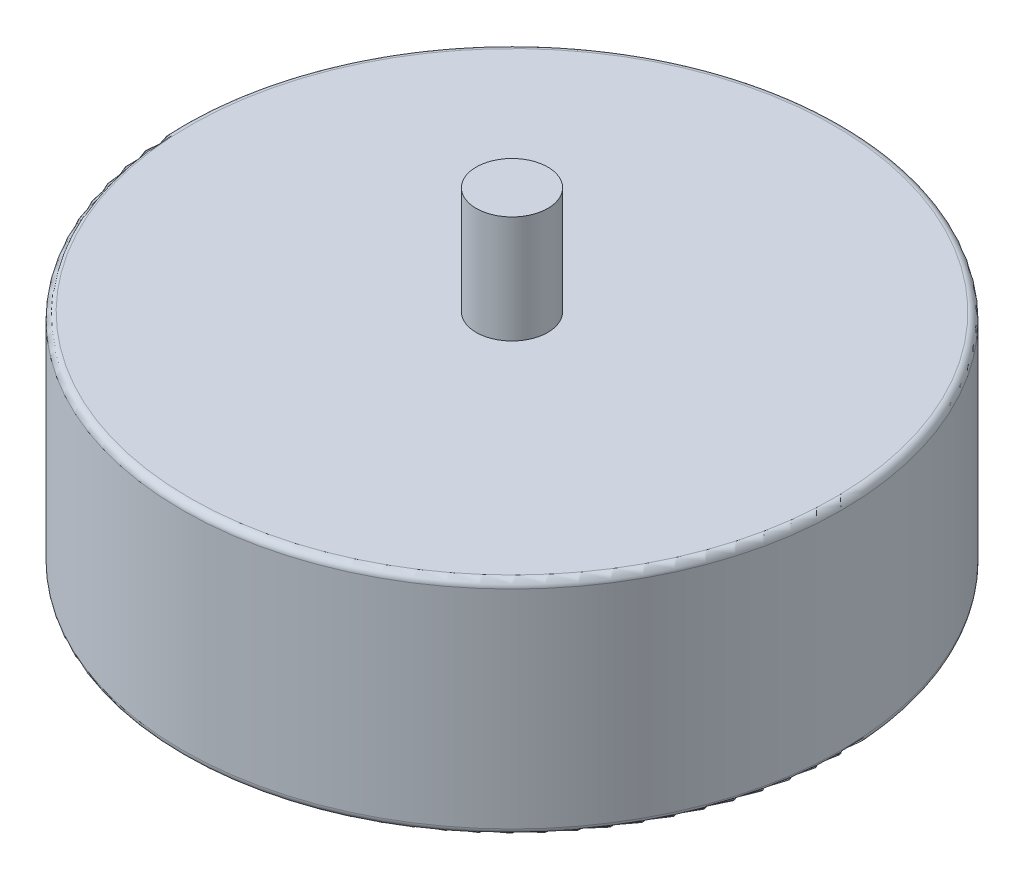
ISO-10303-21;
HEADER;
FILE_DESCRIPTION(('STEP AP214'),'2;1');
FILE_NAME('part.step','',(''),(''),'','','');
FILE_SCHEMA(('AUTOMOTIVE_DESIGN { 1 0 10303 214 1 1 1 1 }'));
ENDSEC;
DATA;
#1=APPLICATION_CONTEXT('core data for automotive mechanical design processes');
#2=APPLICATION_PROTOCOL_DEFINITION('international standard','automotive_design',2000,#1);
#3=PRODUCT_CONTEXT('',#1,'mechanical');
#4=PRODUCT('Part','Part','',(#3));
#5=PRODUCT_RELATED_PRODUCT_CATEGORY('part','',(#4));
#6=PRODUCT_DEFINITION_FORMATION('','',#4);
#7=PRODUCT_DEFINITION_CONTEXT('part definition',#1,'design');
#8=PRODUCT_DEFINITION('design','',#6,#7);
#9=PRODUCT_DEFINITION_SHAPE('','',#8);
#10=(LENGTH_UNIT() NAMED_UNIT(*) SI_UNIT(.MILLI.,.METRE.));
#11=(NAMED_UNIT(*) PLANE_ANGLE_UNIT() SI_UNIT($,.RADIAN.));
#12=(NAMED_UNIT(*) SI_UNIT($,.STERADIAN.) SOLID_ANGLE_UNIT());
#13=UNCERTAINTY_MEASURE_WITH_UNIT(LENGTH_MEASURE(1.E-05),#10,'distance_accuracy_value','');
#14=(GEOMETRIC_REPRESENTATION_CONTEXT(3) GLOBAL_UNCERTAINTY_ASSIGNED_CONTEXT((#13)) GLOBAL_UNIT_ASSIGNED_CONTEXT((#10,
#11,#12)) REPRESENTATION_CONTEXT('',''));
#15=CARTESIAN_POINT('',(0.,0.,0.));
#16=DIRECTION('',(0.,0.,1.));
#17=DIRECTION('',(1.,0.,0.));
#18=AXIS2_PLACEMENT_3D('',#15,#16,#17);
#19=CARTESIAN_POINT('',(0.,31.,0.));
#20=DIRECTION('',(0.,-1.,0.));
#21=DIRECTION('',(0.,0.,-1.));
#22=AXIS2_PLACEMENT_3D('',#19,#20,#21);
#23=CYLINDRICAL_SURFACE('',#22,46.);
#24=CARTESIAN_POINT('',(0.,1.,0.));
#25=DIRECTION('',(0.,1.,0.));
#26=DIRECTION('',(0.,0.,1.));
#27=AXIS2_PLACEMENT_3D('',#24,#25,#26);
#28=CIRCLE('',#27,46.);
#29=CARTESIAN_POINT('',(0.,1.,46.));
#30=VERTEX_POINT('',#29);
#31=EDGE_CURVE('E50',#30,#30,#28,.T.);
#32=ORIENTED_EDGE('',*,*,#31,.T.);
#33=EDGE_LOOP('',(#32));
#34=FACE_BOUND('',#33,.T.);
#35=CARTESIAN_POINT('',(0.,30.,0.));
#36=DIRECTION('',(0.,1.,0.));
#37=DIRECTION('',(0.,0.,1.));
#38=AXIS2_PLACEMENT_3D('',#35,#36,#37);
#39=CIRCLE('',#38,46.);
#40=CARTESIAN_POINT('',(0.,30.,46.));
#41=VERTEX_POINT('',#40);
#42=EDGE_CURVE('E55',#41,#41,#39,.F.);
#43=ORIENTED_EDGE('',*,*,#42,.T.);
#44=EDGE_LOOP('',(#43));
#45=FACE_BOUND('',#44,.T.);
#46=ADVANCED_FACE('F37',(#34,#45),#23,.T.);
#47=CARTESIAN_POINT('',(0.,31.,0.));
#48=DIRECTION('',(0.,1.,0.));
#49=DIRECTION('',(0.,0.,1.));
#50=AXIS2_PLACEMENT_3D('',#47,#48,#49);
#51=PLANE('',#50);
#52=CARTESIAN_POINT('',(0.,31.,0.));
#53=DIRECTION('',(0.,1.,0.));
#54=DIRECTION('',(0.,0.,1.));
#55=AXIS2_PLACEMENT_3D('',#52,#53,#54);
#56=CIRCLE('',#55,45.);
#57=CARTESIAN_POINT('',(0.,31.,45.));
#58=VERTEX_POINT('',#57);
#59=EDGE_CURVE('E10',#58,#58,#56,.T.);
#60=ORIENTED_EDGE('',*,*,#59,.T.);
#61=EDGE_LOOP('',(#60));
#62=FACE_BOUND('',#61,.T.);
#63=CARTESIAN_POINT('',(0.,31.,0.));
#64=DIRECTION('',(0.,1.,0.));
#65=DIRECTION('',(0.,0.,1.));
#66=AXIS2_PLACEMENT_3D('',#63,#64,#65);
#67=CIRCLE('',#66,5.);
#68=CARTESIAN_POINT('',(0.,31.,5.));
#69=VERTEX_POINT('',#68);
#70=EDGE_CURVE('E62',#69,#69,#67,.T.);
#71=ORIENTED_EDGE('',*,*,#70,.F.);
#72=EDGE_LOOP('',(#71));
#73=FACE_BOUND('',#72,.T.);
#74=ADVANCED_FACE('F79',(#62,#73),#51,.T.);
#75=CARTESIAN_POINT('',(0.,0.,0.));
#76=DIRECTION('',(0.,1.,0.));
#77=DIRECTION('',(0.,0.,1.));
#78=AXIS2_PLACEMENT_3D('',#75,#76,#77);
#79=PLANE('',#78);
#80=CARTESIAN_POINT('',(0.,0.,0.));
#81=DIRECTION('',(0.,1.,0.));
#82=DIRECTION('',(0.,0.,1.));
#83=AXIS2_PLACEMENT_3D('',#80,#81,#82);
#84=CIRCLE('',#83,45.);
#85=CARTESIAN_POINT('',(0.,0.,45.));
#86=VERTEX_POINT('',#85);
#87=EDGE_CURVE('E45',#86,#86,#84,.F.);
#88=ORIENTED_EDGE('',*,*,#87,.T.);
#89=EDGE_LOOP('',(#88));
#90=FACE_BOUND('',#89,.T.);
#91=ADVANCED_FACE('F75',(#90),#79,.F.);
#92=CARTESIAN_POINT('',(0.,46.,0.));
#93=DIRECTION('',(0.,-1.,0.));
#94=DIRECTION('',(0.,0.,-1.));
#95=AXIS2_PLACEMENT_3D('',#92,#93,#94);
#96=CYLINDRICAL_SURFACE('',#95,5.);
#97=CARTESIAN_POINT('',(0.,46.,0.));
#98=DIRECTION('',(0.,1.,0.));
#99=DIRECTION('',(0.,0.,1.));
#100=AXIS2_PLACEMENT_3D('',#97,#98,#99);
#101=CIRCLE('',#100,5.);
#102=CARTESIAN_POINT('',(0.,46.,5.));
#103=VERTEX_POINT('',#102);
#104=EDGE_CURVE('E61',#103,#103,#101,.T.);
#105=ORIENTED_EDGE('',*,*,#104,.F.);
#106=EDGE_LOOP('',(#105));
#107=FACE_BOUND('',#106,.T.);
#108=ORIENTED_EDGE('',*,*,#70,.T.);
#109=EDGE_LOOP('',(#108));
#110=FACE_BOUND('',#109,.T.);
#111=ADVANCED_FACE('F72',(#107,#110),#96,.T.);
#112=CARTESIAN_POINT('',(0.,46.,0.));
#113=DIRECTION('',(0.,1.,0.));
#114=DIRECTION('',(0.,0.,1.));
#115=AXIS2_PLACEMENT_3D('',#112,#113,#114);
#116=PLANE('',#115);
#117=ORIENTED_EDGE('',*,*,#104,.T.);
#118=EDGE_LOOP('',(#117));
#119=FACE_BOUND('',#118,.T.);
#120=ADVANCED_FACE('F70',(#119),#116,.T.);
#121=CARTESIAN_POINT('',(0.,1.,0.));
#122=DIRECTION('',(0.,1.,0.));
#123=DIRECTION('',(0.,0.,1.));
#124=AXIS2_PLACEMENT_3D('',#121,#122,#123);
#125=TOROIDAL_SURFACE('',#124,45.,1.);
#126=ORIENTED_EDGE('',*,*,#87,.F.);
#127=EDGE_LOOP('',(#126));
#128=FACE_BOUND('',#127,.T.);
#129=ORIENTED_EDGE('',*,*,#31,.F.);
#130=EDGE_LOOP('',(#129));
#131=FACE_BOUND('',#130,.T.);
#132=ADVANCED_FACE('F90',(#128,#131),#125,.T.);
#133=CARTESIAN_POINT('',(0.,30.,0.));
#134=DIRECTION('',(0.,1.,0.));
#135=DIRECTION('',(0.,0.,1.));
#136=AXIS2_PLACEMENT_3D('',#133,#134,#135);
#137=TOROIDAL_SURFACE('',#136,45.,1.);
#138=ORIENTED_EDGE('',*,*,#42,.F.);
#139=EDGE_LOOP('',(#138));
#140=FACE_BOUND('',#139,.T.);
#141=ORIENTED_EDGE('',*,*,#59,.F.);
#142=EDGE_LOOP('',(#141));
#143=FACE_BOUND('',#142,.T.);
#144=ADVANCED_FACE('F39',(#140,#143),#137,.T.);
#145=CLOSED_SHELL('',(#46,#74,#91,#111,#120,#132,#144));
#146=MANIFOLD_SOLID_BREP('B2',#145);
#147=ADVANCED_BREP_SHAPE_REPRESENTATION('',(#18,#146),#14);
#148=SHAPE_DEFINITION_REPRESENTATION(#9,#147);
ENDSEC;
END-ISO-10303-21;
